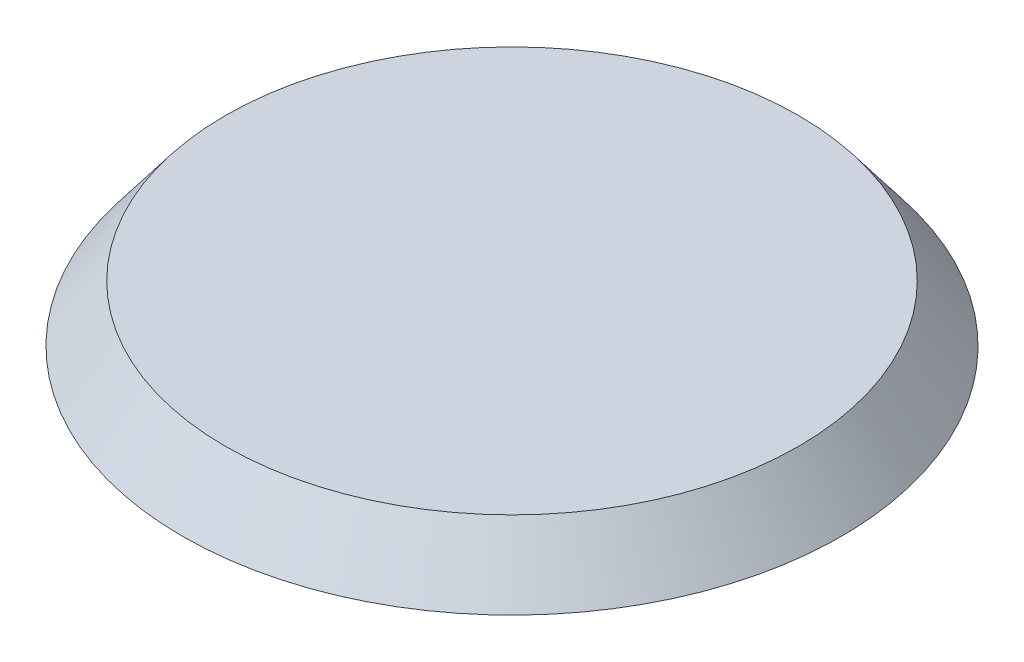
ISO-10303-21;
HEADER;
FILE_DESCRIPTION(('STEP AP214'),'2;1');
FILE_NAME('part.step','',(''),(''),'','','');
FILE_SCHEMA(('AUTOMOTIVE_DESIGN { 1 0 10303 214 1 1 1 1 }'));
ENDSEC;
DATA;
#1=APPLICATION_CONTEXT('core data for automotive mechanical design processes');
#2=APPLICATION_PROTOCOL_DEFINITION('international standard','automotive_design',2000,#1);
#3=PRODUCT_CONTEXT('',#1,'mechanical');
#4=PRODUCT('Part','Part','',(#3));
#5=PRODUCT_RELATED_PRODUCT_CATEGORY('part','',(#4));
#6=PRODUCT_DEFINITION_FORMATION('','',#4);
#7=PRODUCT_DEFINITION_CONTEXT('part definition',#1,'design');
#8=PRODUCT_DEFINITION('design','',#6,#7);
#9=PRODUCT_DEFINITION_SHAPE('','',#8);
#10=(LENGTH_UNIT() NAMED_UNIT(*) SI_UNIT(.MILLI.,.METRE.));
#11=(NAMED_UNIT(*) PLANE_ANGLE_UNIT() SI_UNIT($,.RADIAN.));
#12=(NAMED_UNIT(*) SI_UNIT($,.STERADIAN.) SOLID_ANGLE_UNIT());
#13=UNCERTAINTY_MEASURE_WITH_UNIT(LENGTH_MEASURE(1.E-05),#10,'distance_accuracy_value','');
#14=(GEOMETRIC_REPRESENTATION_CONTEXT(3) GLOBAL_UNCERTAINTY_ASSIGNED_CONTEXT((#13)) GLOBAL_UNIT_ASSIGNED_CONTEXT((#10,
#11,#12)) REPRESENTATION_CONTEXT('',''));
#15=CARTESIAN_POINT('',(0.,0.,0.));
#16=DIRECTION('',(0.,0.,1.));
#17=DIRECTION('',(1.,0.,0.));
#18=AXIS2_PLACEMENT_3D('',#15,#16,#17);
#19=CARTESIAN_POINT('',(0.,33.5413650196716,0.));
#20=DIRECTION('',(0.,-1.,0.));
#21=DIRECTION('',(0.,0.,-1.));
#22=AXIS2_PLACEMENT_3D('',#19,#20,#21);
#23=PLANE('',#22);
#24=CARTESIAN_POINT('',(0.,33.5413650196716,0.));
#25=DIRECTION('',(0.,-1.,0.));
#26=DIRECTION('',(0.,0.,-1.));
#27=AXIS2_PLACEMENT_3D('',#24,#25,#26);
#28=CIRCLE('',#27,25.4);
#29=CARTESIAN_POINT('',(0.,33.5413650196716,-25.4));
#30=VERTEX_POINT('',#29);
#31=EDGE_CURVE('E10',#30,#30,#28,.T.);
#32=ORIENTED_EDGE('',*,*,#31,.F.);
#33=EDGE_LOOP('',(#32));
#34=FACE_BOUND('',#33,.T.);
#35=ADVANCED_FACE('F29',(#34),#23,.F.);
#36=CARTESIAN_POINT('',(0.,33.5413650196716,0.));
#37=DIRECTION('',(0.,-1.,0.));
#38=DIRECTION('',(0.,0.,-1.));
#39=AXIS2_PLACEMENT_3D('',#36,#37,#38);
#40=CONICAL_SURFACE('',#39,25.4,0.651136976927655);
#41=CARTESIAN_POINT('',(0.,28.5413650196716,0.));
#42=DIRECTION('',(0.,-1.,0.));
#43=DIRECTION('',(0.,0.,-1.));
#44=AXIS2_PLACEMENT_3D('',#41,#42,#43);
#45=CIRCLE('',#44,29.21);
#46=CARTESIAN_POINT('',(0.,28.5413650196716,-29.21));
#47=VERTEX_POINT('',#46);
#48=EDGE_CURVE('E35',#47,#47,#45,.T.);
#49=ORIENTED_EDGE('',*,*,#48,.F.);
#50=EDGE_LOOP('',(#49));
#51=FACE_BOUND('',#50,.T.);
#52=ORIENTED_EDGE('',*,*,#31,.T.);
#53=EDGE_LOOP('',(#52));
#54=FACE_BOUND('',#53,.T.);
#55=ADVANCED_FACE('F43',(#51,#54),#40,.T.);
#56=CARTESIAN_POINT('',(0.,28.5413650196716,29.21));
#57=DIRECTION('',(0.,1.,0.));
#58=DIRECTION('',(0.,0.,1.));
#59=AXIS2_PLACEMENT_3D('',#56,#57,#58);
#60=PLANE('',#59);
#61=ORIENTED_EDGE('',*,*,#48,.T.);
#62=EDGE_LOOP('',(#61));
#63=FACE_BOUND('',#62,.T.);
#64=ADVANCED_FACE('F41',(#63),#60,.F.);
#65=CLOSED_SHELL('',(#35,#55,#64));
#66=MANIFOLD_SOLID_BREP('B2',#65);
#67=ADVANCED_BREP_SHAPE_REPRESENTATION('',(#18,#66),#14);
#68=SHAPE_DEFINITION_REPRESENTATION(#9,#67);
ENDSEC;
END-ISO-10303-21;
